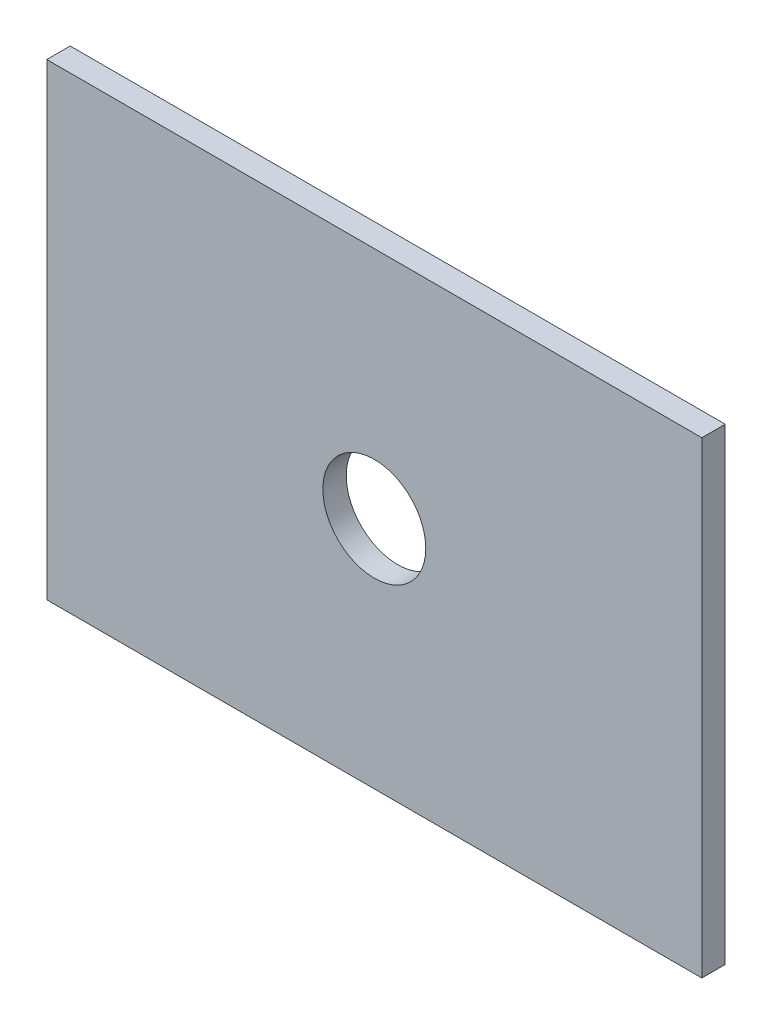
ISO-10303-21;
HEADER;
FILE_DESCRIPTION(('STEP AP214'),'2;1');
FILE_NAME('part.step','',(''),(''),'','','');
FILE_SCHEMA(('AUTOMOTIVE_DESIGN { 1 0 10303 214 1 1 1 1 }'));
ENDSEC;
DATA;
#1=APPLICATION_CONTEXT('core data for automotive mechanical design processes');
#2=APPLICATION_PROTOCOL_DEFINITION('international standard','automotive_design',2000,#1);
#3=PRODUCT_CONTEXT('',#1,'mechanical');
#4=PRODUCT('Part','Part','',(#3));
#5=PRODUCT_RELATED_PRODUCT_CATEGORY('part','',(#4));
#6=PRODUCT_DEFINITION_FORMATION('','',#4);
#7=PRODUCT_DEFINITION_CONTEXT('part definition',#1,'design');
#8=PRODUCT_DEFINITION('design','',#6,#7);
#9=PRODUCT_DEFINITION_SHAPE('','',#8);
#10=(LENGTH_UNIT() NAMED_UNIT(*) SI_UNIT(.MILLI.,.METRE.));
#11=(NAMED_UNIT(*) PLANE_ANGLE_UNIT() SI_UNIT($,.RADIAN.));
#12=(NAMED_UNIT(*) SI_UNIT($,.STERADIAN.) SOLID_ANGLE_UNIT());
#13=UNCERTAINTY_MEASURE_WITH_UNIT(LENGTH_MEASURE(1.E-05),#10,'distance_accuracy_value','');
#14=(GEOMETRIC_REPRESENTATION_CONTEXT(3) GLOBAL_UNCERTAINTY_ASSIGNED_CONTEXT((#13)) GLOBAL_UNIT_ASSIGNED_CONTEXT((#10,
#11,#12)) REPRESENTATION_CONTEXT('',''));
#15=CARTESIAN_POINT('',(0.,0.,0.));
#16=DIRECTION('',(0.,0.,1.));
#17=DIRECTION('',(1.,0.,0.));
#18=AXIS2_PLACEMENT_3D('',#15,#16,#17);
#19=CARTESIAN_POINT('',(70.,50.,5.));
#20=DIRECTION('',(-1.,0.,0.));
#21=DIRECTION('',(0.,0.,1.));
#22=AXIS2_PLACEMENT_3D('',#19,#20,#21);
#23=PLANE('',#22);
#24=DIRECTION('',(0.,1.,0.));
#25=VECTOR('',#24,1.);
#26=CARTESIAN_POINT('',(70.,50.,0.));
#27=LINE('',#26,#25);
#28=CARTESIAN_POINT('',(70.,-50.,0.));
#29=VERTEX_POINT('',#28);
#30=CARTESIAN_POINT('',(70.,50.,0.));
#31=VERTEX_POINT('',#30);
#32=EDGE_CURVE('E98',#29,#31,#27,.T.);
#33=ORIENTED_EDGE('',*,*,#32,.T.);
#34=DIRECTION('',(0.,0.,-1.));
#35=VECTOR('',#34,1.);
#36=CARTESIAN_POINT('',(70.,50.,5.));
#37=LINE('',#36,#35);
#38=CARTESIAN_POINT('',(70.,50.,5.));
#39=VERTEX_POINT('',#38);
#40=EDGE_CURVE('E11',#39,#31,#37,.T.);
#41=ORIENTED_EDGE('',*,*,#40,.F.);
#42=DIRECTION('',(0.,1.,0.));
#43=VECTOR('',#42,1.);
#44=CARTESIAN_POINT('',(70.,50.,5.));
#45=LINE('',#44,#43);
#46=CARTESIAN_POINT('',(70.,-50.,5.));
#47=VERTEX_POINT('',#46);
#48=EDGE_CURVE('E86',#47,#39,#45,.T.);
#49=ORIENTED_EDGE('',*,*,#48,.F.);
#50=DIRECTION('',(0.,0.,-1.));
#51=VECTOR('',#50,1.);
#52=CARTESIAN_POINT('',(70.,-50.,5.));
#53=LINE('',#52,#51);
#54=EDGE_CURVE('E94',#47,#29,#53,.T.);
#55=ORIENTED_EDGE('',*,*,#54,.T.);
#56=EDGE_LOOP('',(#33,#41,#49,#55));
#57=FACE_BOUND('',#56,.T.);
#58=ADVANCED_FACE('F35',(#57),#23,.F.);
#59=CARTESIAN_POINT('',(-70.,50.,5.));
#60=DIRECTION('',(0.,-1.,0.));
#61=DIRECTION('',(0.,0.,-1.));
#62=AXIS2_PLACEMENT_3D('',#59,#60,#61);
#63=PLANE('',#62);
#64=DIRECTION('',(-1.,0.,0.));
#65=VECTOR('',#64,1.);
#66=CARTESIAN_POINT('',(-70.,50.,0.));
#67=LINE('',#66,#65);
#68=CARTESIAN_POINT('',(-70.,50.,0.));
#69=VERTEX_POINT('',#68);
#70=EDGE_CURVE('E90',#31,#69,#67,.T.);
#71=ORIENTED_EDGE('',*,*,#70,.T.);
#72=DIRECTION('',(0.,0.,-1.));
#73=VECTOR('',#72,1.);
#74=CARTESIAN_POINT('',(-70.,50.,5.));
#75=LINE('',#74,#73);
#76=CARTESIAN_POINT('',(-70.,50.,5.));
#77=VERTEX_POINT('',#76);
#78=EDGE_CURVE('E43',#77,#69,#75,.T.);
#79=ORIENTED_EDGE('',*,*,#78,.F.);
#80=DIRECTION('',(-1.,0.,0.));
#81=VECTOR('',#80,1.);
#82=CARTESIAN_POINT('',(-70.,50.,5.));
#83=LINE('',#82,#81);
#84=EDGE_CURVE('E81',#39,#77,#83,.T.);
#85=ORIENTED_EDGE('',*,*,#84,.F.);
#86=ORIENTED_EDGE('',*,*,#40,.T.);
#87=EDGE_LOOP('',(#71,#79,#85,#86));
#88=FACE_BOUND('',#87,.T.);
#89=ADVANCED_FACE('F89',(#88),#63,.F.);
#90=CARTESIAN_POINT('',(-70.,50.,5.));
#91=DIRECTION('',(1.,0.,0.));
#92=DIRECTION('',(0.,1.,0.));
#93=AXIS2_PLACEMENT_3D('',#90,#91,#92);
#94=PLANE('',#93);
#95=DIRECTION('',(0.,-1.,0.));
#96=VECTOR('',#95,1.);
#97=CARTESIAN_POINT('',(-70.,50.,0.));
#98=LINE('',#97,#96);
#99=CARTESIAN_POINT('',(-70.,-50.,0.));
#100=VERTEX_POINT('',#99);
#101=EDGE_CURVE('E68',#69,#100,#98,.T.);
#102=ORIENTED_EDGE('',*,*,#101,.T.);
#103=DIRECTION('',(0.,0.,-1.));
#104=VECTOR('',#103,1.);
#105=CARTESIAN_POINT('',(-70.,-50.,5.));
#106=LINE('',#105,#104);
#107=CARTESIAN_POINT('',(-70.,-50.,5.));
#108=VERTEX_POINT('',#107);
#109=EDGE_CURVE('E91',#108,#100,#106,.T.);
#110=ORIENTED_EDGE('',*,*,#109,.F.);
#111=DIRECTION('',(0.,-1.,0.));
#112=VECTOR('',#111,1.);
#113=CARTESIAN_POINT('',(-70.,50.,5.));
#114=LINE('',#113,#112);
#115=EDGE_CURVE('E84',#77,#108,#114,.T.);
#116=ORIENTED_EDGE('',*,*,#115,.F.);
#117=ORIENTED_EDGE('',*,*,#78,.T.);
#118=EDGE_LOOP('',(#102,#110,#116,#117));
#119=FACE_BOUND('',#118,.T.);
#120=ADVANCED_FACE('F92',(#119),#94,.F.);
#121=CARTESIAN_POINT('',(-70.,-50.,5.));
#122=DIRECTION('',(0.,1.,0.));
#123=DIRECTION('',(0.,0.,1.));
#124=AXIS2_PLACEMENT_3D('',#121,#122,#123);
#125=PLANE('',#124);
#126=DIRECTION('',(1.,0.,0.));
#127=VECTOR('',#126,1.);
#128=CARTESIAN_POINT('',(-70.,-50.,0.));
#129=LINE('',#128,#127);
#130=EDGE_CURVE('E74',#100,#29,#129,.T.);
#131=ORIENTED_EDGE('',*,*,#130,.T.);
#132=ORIENTED_EDGE('',*,*,#54,.F.);
#133=DIRECTION('',(1.,0.,0.));
#134=VECTOR('',#133,1.);
#135=CARTESIAN_POINT('',(-70.,-50.,5.));
#136=LINE('',#135,#134);
#137=EDGE_CURVE('E51',#108,#47,#136,.T.);
#138=ORIENTED_EDGE('',*,*,#137,.F.);
#139=ORIENTED_EDGE('',*,*,#109,.T.);
#140=EDGE_LOOP('',(#131,#132,#138,#139));
#141=FACE_BOUND('',#140,.T.);
#142=ADVANCED_FACE('F106',(#141),#125,.F.);
#143=CARTESIAN_POINT('',(0.,0.,5.));
#144=DIRECTION('',(0.,0.,1.));
#145=DIRECTION('',(1.,0.,0.));
#146=AXIS2_PLACEMENT_3D('',#143,#144,#145);
#147=PLANE('',#146);
#148=CARTESIAN_POINT('',(0.,0.,5.));
#149=DIRECTION('',(0.,0.,1.));
#150=DIRECTION('',(1.,0.,0.));
#151=AXIS2_PLACEMENT_3D('',#148,#149,#150);
#152=CIRCLE('',#151,11.);
#153=CARTESIAN_POINT('',(11.,0.,5.));
#154=VERTEX_POINT('',#153);
#155=EDGE_CURVE('E112',#154,#154,#152,.T.);
#156=ORIENTED_EDGE('',*,*,#155,.F.);
#157=EDGE_LOOP('',(#156));
#158=FACE_BOUND('',#157,.T.);
#159=ORIENTED_EDGE('',*,*,#48,.T.);
#160=ORIENTED_EDGE('',*,*,#84,.T.);
#161=ORIENTED_EDGE('',*,*,#115,.T.);
#162=ORIENTED_EDGE('',*,*,#137,.T.);
#163=EDGE_LOOP('',(#159,#160,#161,#162));
#164=FACE_BOUND('',#163,.T.);
#165=ADVANCED_FACE('F82',(#158,#164),#147,.T.);
#166=CARTESIAN_POINT('',(0.,0.,0.));
#167=DIRECTION('',(0.,0.,1.));
#168=DIRECTION('',(1.,0.,0.));
#169=AXIS2_PLACEMENT_3D('',#166,#167,#168);
#170=PLANE('',#169);
#171=CARTESIAN_POINT('',(0.,0.,0.));
#172=DIRECTION('',(0.,0.,1.));
#173=DIRECTION('',(1.,0.,0.));
#174=AXIS2_PLACEMENT_3D('',#171,#172,#173);
#175=CIRCLE('',#174,11.);
#176=CARTESIAN_POINT('',(11.,0.,0.));
#177=VERTEX_POINT('',#176);
#178=EDGE_CURVE('E101',#177,#177,#175,.T.);
#179=ORIENTED_EDGE('',*,*,#178,.T.);
#180=EDGE_LOOP('',(#179));
#181=FACE_BOUND('',#180,.T.);
#182=ORIENTED_EDGE('',*,*,#32,.F.);
#183=ORIENTED_EDGE('',*,*,#130,.F.);
#184=ORIENTED_EDGE('',*,*,#101,.F.);
#185=ORIENTED_EDGE('',*,*,#70,.F.);
#186=EDGE_LOOP('',(#182,#183,#184,#185));
#187=FACE_BOUND('',#186,.T.);
#188=ADVANCED_FACE('F109',(#181,#187),#170,.F.);
#189=CARTESIAN_POINT('',(0.,0.,0.));
#190=DIRECTION('',(0.,0.,1.));
#191=DIRECTION('',(1.,0.,0.));
#192=AXIS2_PLACEMENT_3D('',#189,#190,#191);
#193=CYLINDRICAL_SURFACE('',#192,11.);
#194=ORIENTED_EDGE('',*,*,#178,.F.);
#195=EDGE_LOOP('',(#194));
#196=FACE_BOUND('',#195,.T.);
#197=ORIENTED_EDGE('',*,*,#155,.T.);
#198=EDGE_LOOP('',(#197));
#199=FACE_BOUND('',#198,.T.);
#200=ADVANCED_FACE('F119',(#196,#199),#193,.F.);
#201=CLOSED_SHELL('',(#58,#89,#120,#142,#165,#188,#200));
#202=MANIFOLD_SOLID_BREP('B2',#201);
#203=ADVANCED_BREP_SHAPE_REPRESENTATION('',(#18,#202),#14);
#204=SHAPE_DEFINITION_REPRESENTATION(#9,#203);
ENDSEC;
END-ISO-10303-21;
